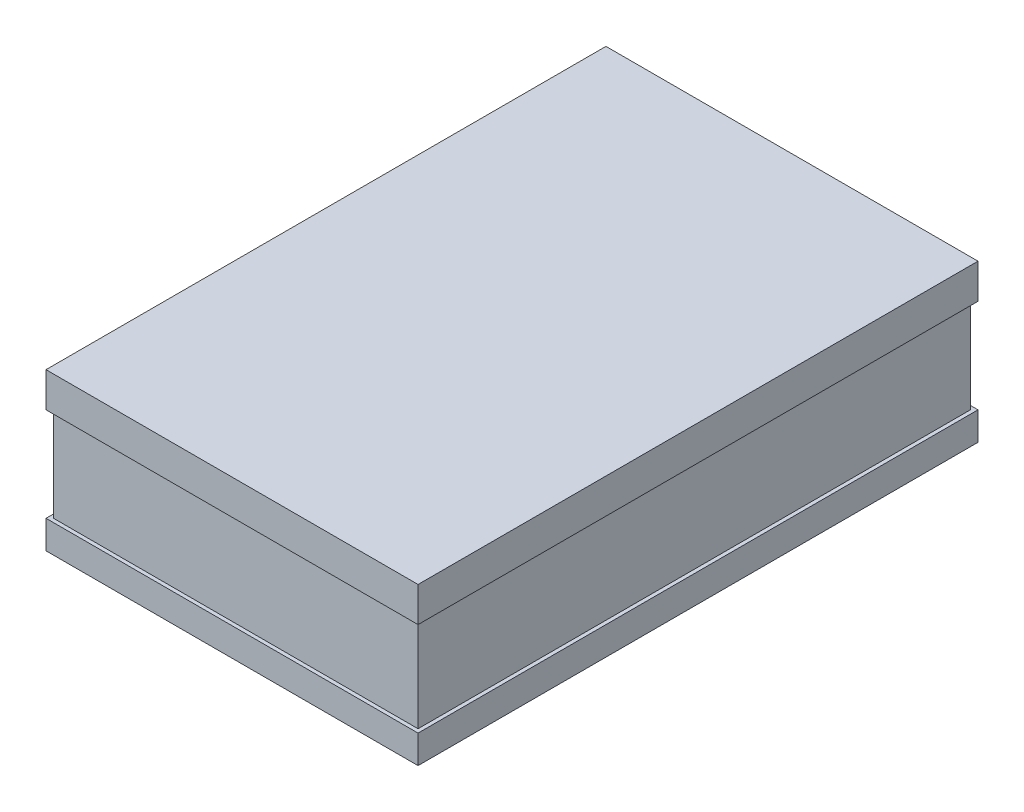
ISO-10303-21;
HEADER;
FILE_DESCRIPTION(('STEP AP214'),'2;1');
FILE_NAME('part.step','',(''),(''),'','','');
FILE_SCHEMA(('AUTOMOTIVE_DESIGN { 1 0 10303 214 1 1 1 1 }'));
ENDSEC;
DATA;
#1=APPLICATION_CONTEXT('core data for automotive mechanical design processes');
#2=APPLICATION_PROTOCOL_DEFINITION('international standard','automotive_design',2000,#1);
#3=PRODUCT_CONTEXT('',#1,'mechanical');
#4=PRODUCT('Part','Part','',(#3));
#5=PRODUCT_RELATED_PRODUCT_CATEGORY('part','',(#4));
#6=PRODUCT_DEFINITION_FORMATION('','',#4);
#7=PRODUCT_DEFINITION_CONTEXT('part definition',#1,'design');
#8=PRODUCT_DEFINITION('design','',#6,#7);
#9=PRODUCT_DEFINITION_SHAPE('','',#8);
#10=(LENGTH_UNIT() NAMED_UNIT(*) SI_UNIT(.MILLI.,.METRE.));
#11=(NAMED_UNIT(*) PLANE_ANGLE_UNIT() SI_UNIT($,.RADIAN.));
#12=(NAMED_UNIT(*) SI_UNIT($,.STERADIAN.) SOLID_ANGLE_UNIT());
#13=UNCERTAINTY_MEASURE_WITH_UNIT(LENGTH_MEASURE(1.E-05),#10,'distance_accuracy_value','');
#14=(GEOMETRIC_REPRESENTATION_CONTEXT(3) GLOBAL_UNCERTAINTY_ASSIGNED_CONTEXT((#13)) GLOBAL_UNIT_ASSIGNED_CONTEXT((#10,
#11,#12)) REPRESENTATION_CONTEXT('',''));
#15=CARTESIAN_POINT('',(0.,0.,0.));
#16=DIRECTION('',(0.,0.,1.));
#17=DIRECTION('',(1.,0.,0.));
#18=AXIS2_PLACEMENT_3D('',#15,#16,#17);
#19=CARTESIAN_POINT('',(-99.,-80.,149.));
#20=DIRECTION('',(-1.,0.,0.));
#21=DIRECTION('',(0.,0.,1.));
#22=AXIS2_PLACEMENT_3D('',#19,#20,#21);
#23=PLANE('',#22);
#24=DIRECTION('',(0.,1.,0.));
#25=VECTOR('',#24,1.);
#26=CARTESIAN_POINT('',(-99.,-80.,149.));
#27=LINE('',#26,#25);
#28=CARTESIAN_POINT('',(-99.,-80.,149.));
#29=VERTEX_POINT('',#28);
#30=CARTESIAN_POINT('',(-99.,-65.,149.));
#31=VERTEX_POINT('',#30);
#32=EDGE_CURVE('E320',#29,#31,#27,.T.);
#33=ORIENTED_EDGE('',*,*,#32,.T.);
#34=DIRECTION('',(0.,0.,-1.));
#35=VECTOR('',#34,1.);
#36=CARTESIAN_POINT('',(-99.,-65.,149.));
#37=LINE('',#36,#35);
#38=CARTESIAN_POINT('',(-99.,-65.,-149.));
#39=VERTEX_POINT('',#38);
#40=EDGE_CURVE('E55',#31,#39,#37,.T.);
#41=ORIENTED_EDGE('',*,*,#40,.T.);
#42=DIRECTION('',(0.,1.,0.));
#43=VECTOR('',#42,1.);
#44=CARTESIAN_POINT('',(-99.,-80.,-149.));
#45=LINE('',#44,#43);
#46=CARTESIAN_POINT('',(-99.,-80.,-149.));
#47=VERTEX_POINT('',#46);
#48=EDGE_CURVE('E305',#47,#39,#45,.T.);
#49=ORIENTED_EDGE('',*,*,#48,.F.);
#50=DIRECTION('',(0.,0.,1.));
#51=VECTOR('',#50,1.);
#52=CARTESIAN_POINT('',(-99.,-80.,149.));
#53=LINE('',#52,#51);
#54=EDGE_CURVE('E277',#47,#29,#53,.T.);
#55=ORIENTED_EDGE('',*,*,#54,.T.);
#56=EDGE_LOOP('',(#33,#41,#49,#55));
#57=FACE_BOUND('',#56,.T.);
#58=ADVANCED_FACE('F39',(#57),#23,.T.);
#59=CARTESIAN_POINT('',(-99.,-80.,-149.));
#60=DIRECTION('',(0.,0.,-1.));
#61=DIRECTION('',(-1.,0.,0.));
#62=AXIS2_PLACEMENT_3D('',#59,#60,#61);
#63=PLANE('',#62);
#64=ORIENTED_EDGE('',*,*,#48,.T.);
#65=DIRECTION('',(1.,0.,0.));
#66=VECTOR('',#65,1.);
#67=CARTESIAN_POINT('',(-99.,-65.,-149.));
#68=LINE('',#67,#66);
#69=CARTESIAN_POINT('',(99.,-65.,-149.));
#70=VERTEX_POINT('',#69);
#71=EDGE_CURVE('E210',#39,#70,#68,.T.);
#72=ORIENTED_EDGE('',*,*,#71,.T.);
#73=DIRECTION('',(0.,1.,0.));
#74=VECTOR('',#73,1.);
#75=CARTESIAN_POINT('',(99.,-80.,-149.));
#76=LINE('',#75,#74);
#77=CARTESIAN_POINT('',(99.,-80.,-149.));
#78=VERTEX_POINT('',#77);
#79=EDGE_CURVE('E310',#78,#70,#76,.T.);
#80=ORIENTED_EDGE('',*,*,#79,.F.);
#81=DIRECTION('',(-1.,0.,0.));
#82=VECTOR('',#81,1.);
#83=CARTESIAN_POINT('',(-99.,-80.,-149.));
#84=LINE('',#83,#82);
#85=EDGE_CURVE('E300',#78,#47,#84,.T.);
#86=ORIENTED_EDGE('',*,*,#85,.T.);
#87=EDGE_LOOP('',(#64,#72,#80,#86));
#88=FACE_BOUND('',#87,.T.);
#89=ADVANCED_FACE('F334',(#88),#63,.T.);
#90=CARTESIAN_POINT('',(99.,-80.,149.));
#91=DIRECTION('',(1.,0.,0.));
#92=DIRECTION('',(0.,0.,-1.));
#93=AXIS2_PLACEMENT_3D('',#90,#91,#92);
#94=PLANE('',#93);
#95=ORIENTED_EDGE('',*,*,#79,.T.);
#96=DIRECTION('',(0.,0.,1.));
#97=VECTOR('',#96,1.);
#98=CARTESIAN_POINT('',(99.,-65.,149.));
#99=LINE('',#98,#97);
#100=CARTESIAN_POINT('',(99.0000000000001,-65.,149.));
#101=VERTEX_POINT('',#100);
#102=EDGE_CURVE('E201',#70,#101,#99,.T.);
#103=ORIENTED_EDGE('',*,*,#102,.T.);
#104=DIRECTION('',(0.,1.,0.));
#105=VECTOR('',#104,1.);
#106=CARTESIAN_POINT('',(99.,-80.,149.));
#107=LINE('',#106,#105);
#108=CARTESIAN_POINT('',(99.,-80.,149.));
#109=VERTEX_POINT('',#108);
#110=EDGE_CURVE('E315',#109,#101,#107,.T.);
#111=ORIENTED_EDGE('',*,*,#110,.F.);
#112=DIRECTION('',(0.,0.,-1.));
#113=VECTOR('',#112,1.);
#114=CARTESIAN_POINT('',(99.,-80.,149.));
#115=LINE('',#114,#113);
#116=EDGE_CURVE('E296',#109,#78,#115,.T.);
#117=ORIENTED_EDGE('',*,*,#116,.T.);
#118=EDGE_LOOP('',(#95,#103,#111,#117));
#119=FACE_BOUND('',#118,.T.);
#120=ADVANCED_FACE('F336',(#119),#94,.T.);
#121=CARTESIAN_POINT('',(-99.,-80.,149.));
#122=DIRECTION('',(0.,0.,1.));
#123=DIRECTION('',(1.,0.,0.));
#124=AXIS2_PLACEMENT_3D('',#121,#122,#123);
#125=PLANE('',#124);
#126=ORIENTED_EDGE('',*,*,#110,.T.);
#127=DIRECTION('',(-1.,0.,0.));
#128=VECTOR('',#127,1.);
#129=CARTESIAN_POINT('',(-99.,-65.,149.));
#130=LINE('',#129,#128);
#131=EDGE_CURVE('E48',#101,#31,#130,.T.);
#132=ORIENTED_EDGE('',*,*,#131,.T.);
#133=ORIENTED_EDGE('',*,*,#32,.F.);
#134=DIRECTION('',(1.,0.,0.));
#135=VECTOR('',#134,1.);
#136=CARTESIAN_POINT('',(-99.,-80.,149.));
#137=LINE('',#136,#135);
#138=EDGE_CURVE('E292',#29,#109,#137,.T.);
#139=ORIENTED_EDGE('',*,*,#138,.T.);
#140=EDGE_LOOP('',(#126,#132,#133,#139));
#141=FACE_BOUND('',#140,.T.);
#142=ADVANCED_FACE('F325',(#141),#125,.T.);
#143=CARTESIAN_POINT('',(0.,-80.,0.));
#144=DIRECTION('',(0.,-1.,0.));
#145=DIRECTION('',(0.,0.,-1.));
#146=AXIS2_PLACEMENT_3D('',#143,#144,#145);
#147=PLANE('',#146);
#148=DIRECTION('',(1.,0.,0.));
#149=VECTOR('',#148,1.);
#150=CARTESIAN_POINT('',(-87.5,-80.,137.5));
#151=LINE('',#150,#149);
#152=CARTESIAN_POINT('',(-87.5,-80.,137.5));
#153=VERTEX_POINT('',#152);
#154=CARTESIAN_POINT('',(87.5000000000001,-80.,137.5));
#155=VERTEX_POINT('',#154);
#156=EDGE_CURVE('E241',#153,#155,#151,.T.);
#157=ORIENTED_EDGE('',*,*,#156,.T.);
#158=DIRECTION('',(0.,0.,-1.));
#159=VECTOR('',#158,1.);
#160=CARTESIAN_POINT('',(87.5000000000001,-80.,137.5));
#161=LINE('',#160,#159);
#162=CARTESIAN_POINT('',(87.5000000000001,-80.,-137.5));
#163=VERTEX_POINT('',#162);
#164=EDGE_CURVE('E245',#155,#163,#161,.T.);
#165=ORIENTED_EDGE('',*,*,#164,.T.);
#166=DIRECTION('',(-1.,0.,0.));
#167=VECTOR('',#166,1.);
#168=CARTESIAN_POINT('',(-87.5,-80.,-137.5));
#169=LINE('',#168,#167);
#170=CARTESIAN_POINT('',(-87.5,-80.,-137.5));
#171=VERTEX_POINT('',#170);
#172=EDGE_CURVE('E250',#163,#171,#169,.T.);
#173=ORIENTED_EDGE('',*,*,#172,.T.);
#174=DIRECTION('',(0.,0.,1.));
#175=VECTOR('',#174,1.);
#176=CARTESIAN_POINT('',(-87.5,-80.,137.5));
#177=LINE('',#176,#175);
#178=EDGE_CURVE('E254',#171,#153,#177,.T.);
#179=ORIENTED_EDGE('',*,*,#178,.T.);
#180=EDGE_LOOP('',(#157,#165,#173,#179));
#181=FACE_BOUND('',#180,.T.);
#182=ORIENTED_EDGE('',*,*,#54,.F.);
#183=ORIENTED_EDGE('',*,*,#85,.F.);
#184=ORIENTED_EDGE('',*,*,#116,.F.);
#185=ORIENTED_EDGE('',*,*,#138,.F.);
#186=EDGE_LOOP('',(#182,#183,#184,#185));
#187=FACE_BOUND('',#186,.T.);
#188=ADVANCED_FACE('F331',(#181,#187),#147,.T.);
#189=CARTESIAN_POINT('',(-87.5,-80.,137.5));
#190=DIRECTION('',(0.,0.,1.));
#191=DIRECTION('',(1.,0.,0.));
#192=AXIS2_PLACEMENT_3D('',#189,#190,#191);
#193=PLANE('',#192);
#194=DIRECTION('',(1.,0.,0.));
#195=VECTOR('',#194,1.);
#196=CARTESIAN_POINT('',(-87.5,0.,137.5));
#197=LINE('',#196,#195);
#198=CARTESIAN_POINT('',(-87.5,0.,137.5));
#199=VERTEX_POINT('',#198);
#200=CARTESIAN_POINT('',(87.5000000000001,0.,137.5));
#201=VERTEX_POINT('',#200);
#202=EDGE_CURVE('E240',#199,#201,#197,.T.);
#203=ORIENTED_EDGE('',*,*,#202,.T.);
#204=DIRECTION('',(0.,1.,0.));
#205=VECTOR('',#204,1.);
#206=CARTESIAN_POINT('',(87.5000000000001,-80.,137.5));
#207=LINE('',#206,#205);
#208=EDGE_CURVE('E258',#155,#201,#207,.T.);
#209=ORIENTED_EDGE('',*,*,#208,.F.);
#210=ORIENTED_EDGE('',*,*,#156,.F.);
#211=DIRECTION('',(0.,1.,0.));
#212=VECTOR('',#211,1.);
#213=CARTESIAN_POINT('',(-87.5,-80.,137.5));
#214=LINE('',#213,#212);
#215=EDGE_CURVE('E273',#153,#199,#214,.T.);
#216=ORIENTED_EDGE('',*,*,#215,.T.);
#217=EDGE_LOOP('',(#203,#209,#210,#216));
#218=FACE_BOUND('',#217,.T.);
#219=ADVANCED_FACE('F399',(#218),#193,.F.);
#220=CARTESIAN_POINT('',(-87.5,-80.,137.5));
#221=DIRECTION('',(-1.,0.,0.));
#222=DIRECTION('',(0.,0.,1.));
#223=AXIS2_PLACEMENT_3D('',#220,#221,#222);
#224=PLANE('',#223);
#225=DIRECTION('',(0.,0.,1.));
#226=VECTOR('',#225,1.);
#227=CARTESIAN_POINT('',(-87.5,0.,137.5));
#228=LINE('',#227,#226);
#229=CARTESIAN_POINT('',(-87.5,0.,-137.5));
#230=VERTEX_POINT('',#229);
#231=EDGE_CURVE('E246',#230,#199,#228,.T.);
#232=ORIENTED_EDGE('',*,*,#231,.T.);
#233=ORIENTED_EDGE('',*,*,#215,.F.);
#234=ORIENTED_EDGE('',*,*,#178,.F.);
#235=DIRECTION('',(0.,1.,0.));
#236=VECTOR('',#235,1.);
#237=CARTESIAN_POINT('',(-87.5,-80.,-137.5));
#238=LINE('',#237,#236);
#239=EDGE_CURVE('E278',#171,#230,#238,.T.);
#240=ORIENTED_EDGE('',*,*,#239,.T.);
#241=EDGE_LOOP('',(#232,#233,#234,#240));
#242=FACE_BOUND('',#241,.T.);
#243=ADVANCED_FACE('F405',(#242),#224,.F.);
#244=CARTESIAN_POINT('',(-87.5,-80.,-137.5));
#245=DIRECTION('',(0.,0.,-1.));
#246=DIRECTION('',(-1.,0.,0.));
#247=AXIS2_PLACEMENT_3D('',#244,#245,#246);
#248=PLANE('',#247);
#249=DIRECTION('',(-1.,0.,0.));
#250=VECTOR('',#249,1.);
#251=CARTESIAN_POINT('',(-87.5,0.,-137.5));
#252=LINE('',#251,#250);
#253=CARTESIAN_POINT('',(87.5000000000001,0.,-137.5));
#254=VERTEX_POINT('',#253);
#255=EDGE_CURVE('E266',#254,#230,#252,.T.);
#256=ORIENTED_EDGE('',*,*,#255,.T.);
#257=ORIENTED_EDGE('',*,*,#239,.F.);
#258=ORIENTED_EDGE('',*,*,#172,.F.);
#259=DIRECTION('',(0.,1.,0.));
#260=VECTOR('',#259,1.);
#261=CARTESIAN_POINT('',(87.5000000000001,-80.,-137.5));
#262=LINE('',#261,#260);
#263=EDGE_CURVE('E282',#163,#254,#262,.T.);
#264=ORIENTED_EDGE('',*,*,#263,.T.);
#265=EDGE_LOOP('',(#256,#257,#258,#264));
#266=FACE_BOUND('',#265,.T.);
#267=ADVANCED_FACE('F413',(#266),#248,.F.);
#268=CARTESIAN_POINT('',(87.5000000000001,-80.,137.5));
#269=DIRECTION('',(1.,0.,0.));
#270=DIRECTION('',(0.,0.,-1.));
#271=AXIS2_PLACEMENT_3D('',#268,#269,#270);
#272=PLANE('',#271);
#273=DIRECTION('',(0.,0.,-1.));
#274=VECTOR('',#273,1.);
#275=CARTESIAN_POINT('',(87.5000000000001,0.,137.5));
#276=LINE('',#275,#274);
#277=EDGE_CURVE('E262',#201,#254,#276,.T.);
#278=ORIENTED_EDGE('',*,*,#277,.T.);
#279=ORIENTED_EDGE('',*,*,#263,.F.);
#280=ORIENTED_EDGE('',*,*,#164,.F.);
#281=ORIENTED_EDGE('',*,*,#208,.T.);
#282=EDGE_LOOP('',(#278,#279,#280,#281));
#283=FACE_BOUND('',#282,.T.);
#284=ADVANCED_FACE('F409',(#283),#272,.F.);
#285=CARTESIAN_POINT('',(0.,0.,0.));
#286=DIRECTION('',(0.,1.,0.));
#287=DIRECTION('',(0.,0.,1.));
#288=AXIS2_PLACEMENT_3D('',#285,#286,#287);
#289=PLANE('',#288);
#290=ORIENTED_EDGE('',*,*,#277,.F.);
#291=ORIENTED_EDGE('',*,*,#202,.F.);
#292=ORIENTED_EDGE('',*,*,#231,.F.);
#293=ORIENTED_EDGE('',*,*,#255,.F.);
#294=EDGE_LOOP('',(#290,#291,#292,#293));
#295=FACE_BOUND('',#294,.T.);
#296=ADVANCED_FACE('F412',(#295),#289,.F.);
#297=CARTESIAN_POINT('',(0.,-15.,0.));
#298=DIRECTION('',(0.,1.,0.));
#299=DIRECTION('',(0.,0.,1.));
#300=AXIS2_PLACEMENT_3D('',#297,#298,#299);
#301=PLANE('',#300);
#302=DIRECTION('',(0.,0.,-1.));
#303=VECTOR('',#302,1.);
#304=CARTESIAN_POINT('',(-99.,-15.,149.));
#305=LINE('',#304,#303);
#306=CARTESIAN_POINT('',(-99.,-15.,149.));
#307=VERTEX_POINT('',#306);
#308=CARTESIAN_POINT('',(-99.,-15.,-149.));
#309=VERTEX_POINT('',#308);
#310=EDGE_CURVE('E221',#307,#309,#305,.T.);
#311=ORIENTED_EDGE('',*,*,#310,.T.);
#312=DIRECTION('',(1.,0.,0.));
#313=VECTOR('',#312,1.);
#314=CARTESIAN_POINT('',(-99.,-15.,-149.));
#315=LINE('',#314,#313);
#316=CARTESIAN_POINT('',(99.,-15.,-149.));
#317=VERTEX_POINT('',#316);
#318=EDGE_CURVE('E218',#309,#317,#315,.T.);
#319=ORIENTED_EDGE('',*,*,#318,.T.);
#320=DIRECTION('',(0.,0.,1.));
#321=VECTOR('',#320,1.);
#322=CARTESIAN_POINT('',(99.,-15.,149.));
#323=LINE('',#322,#321);
#324=CARTESIAN_POINT('',(99.,-15.,149.));
#325=VERTEX_POINT('',#324);
#326=EDGE_CURVE('E62',#317,#325,#323,.T.);
#327=ORIENTED_EDGE('',*,*,#326,.T.);
#328=DIRECTION('',(-1.,0.,0.));
#329=VECTOR('',#328,1.);
#330=CARTESIAN_POINT('',(-99.,-15.,149.));
#331=LINE('',#330,#329);
#332=EDGE_CURVE('E11',#325,#307,#331,.T.);
#333=ORIENTED_EDGE('',*,*,#332,.T.);
#334=EDGE_LOOP('',(#311,#319,#327,#333));
#335=FACE_BOUND('',#334,.T.);
#336=DIRECTION('',(0.,0.,-1.));
#337=VECTOR('',#336,1.);
#338=CARTESIAN_POINT('',(-97.,-15.,-147.));
#339=LINE('',#338,#337);
#340=CARTESIAN_POINT('',(-97.,-15.,147.));
#341=VERTEX_POINT('',#340);
#342=CARTESIAN_POINT('',(-97.,-15.,-147.));
#343=VERTEX_POINT('',#342);
#344=EDGE_CURVE('E170',#341,#343,#339,.T.);
#345=ORIENTED_EDGE('',*,*,#344,.F.);
#346=DIRECTION('',(-1.,0.,0.));
#347=VECTOR('',#346,1.);
#348=CARTESIAN_POINT('',(-97.,-15.,147.));
#349=LINE('',#348,#347);
#350=CARTESIAN_POINT('',(97.,-15.,147.));
#351=VERTEX_POINT('',#350);
#352=EDGE_CURVE('E164',#351,#341,#349,.T.);
#353=ORIENTED_EDGE('',*,*,#352,.F.);
#354=DIRECTION('',(0.,0.,1.));
#355=VECTOR('',#354,1.);
#356=CARTESIAN_POINT('',(97.,-15.,-147.));
#357=LINE('',#356,#355);
#358=CARTESIAN_POINT('',(97.,-15.,-147.));
#359=VERTEX_POINT('',#358);
#360=EDGE_CURVE('E173',#359,#351,#357,.T.);
#361=ORIENTED_EDGE('',*,*,#360,.F.);
#362=DIRECTION('',(1.,0.,0.));
#363=VECTOR('',#362,1.);
#364=CARTESIAN_POINT('',(-97.,-15.,-147.));
#365=LINE('',#364,#363);
#366=EDGE_CURVE('E156',#343,#359,#365,.T.);
#367=ORIENTED_EDGE('',*,*,#366,.F.);
#368=EDGE_LOOP('',(#345,#353,#361,#367));
#369=FACE_BOUND('',#368,.T.);
#370=ADVANCED_FACE('F168',(#335,#369),#301,.F.);
#371=CARTESIAN_POINT('',(0.,-65.,0.));
#372=DIRECTION('',(0.,1.,0.));
#373=DIRECTION('',(0.,0.,1.));
#374=AXIS2_PLACEMENT_3D('',#371,#372,#373);
#375=PLANE('',#374);
#376=ORIENTED_EDGE('',*,*,#131,.F.);
#377=ORIENTED_EDGE('',*,*,#102,.F.);
#378=ORIENTED_EDGE('',*,*,#71,.F.);
#379=ORIENTED_EDGE('',*,*,#40,.F.);
#380=EDGE_LOOP('',(#376,#377,#378,#379));
#381=FACE_BOUND('',#380,.T.);
#382=DIRECTION('',(1.,0.,0.));
#383=VECTOR('',#382,1.);
#384=CARTESIAN_POINT('',(-97.,-65.,-147.));
#385=LINE('',#384,#383);
#386=CARTESIAN_POINT('',(-97.,-65.,-147.));
#387=VERTEX_POINT('',#386);
#388=CARTESIAN_POINT('',(97.,-65.,-147.));
#389=VERTEX_POINT('',#388);
#390=EDGE_CURVE('E158',#387,#389,#385,.T.);
#391=ORIENTED_EDGE('',*,*,#390,.T.);
#392=DIRECTION('',(0.,0.,1.));
#393=VECTOR('',#392,1.);
#394=CARTESIAN_POINT('',(97.,-65.,-147.));
#395=LINE('',#394,#393);
#396=CARTESIAN_POINT('',(97.,-65.,147.));
#397=VERTEX_POINT('',#396);
#398=EDGE_CURVE('E184',#389,#397,#395,.T.);
#399=ORIENTED_EDGE('',*,*,#398,.T.);
#400=DIRECTION('',(-1.,0.,0.));
#401=VECTOR('',#400,1.);
#402=CARTESIAN_POINT('',(-97.,-65.,147.));
#403=LINE('',#402,#401);
#404=CARTESIAN_POINT('',(-97.,-65.,147.));
#405=VERTEX_POINT('',#404);
#406=EDGE_CURVE('E180',#397,#405,#403,.T.);
#407=ORIENTED_EDGE('',*,*,#406,.T.);
#408=DIRECTION('',(0.,0.,-1.));
#409=VECTOR('',#408,1.);
#410=CARTESIAN_POINT('',(-97.,-65.,-147.));
#411=LINE('',#410,#409);
#412=EDGE_CURVE('E191',#405,#387,#411,.T.);
#413=ORIENTED_EDGE('',*,*,#412,.T.);
#414=EDGE_LOOP('',(#391,#399,#407,#413));
#415=FACE_BOUND('',#414,.T.);
#416=ADVANCED_FACE('F337',(#381,#415),#375,.T.);
#417=CARTESIAN_POINT('',(-97.,-15.,-147.));
#418=DIRECTION('',(-1.,0.,0.));
#419=DIRECTION('',(0.,0.,1.));
#420=AXIS2_PLACEMENT_3D('',#417,#418,#419);
#421=PLANE('',#420);
#422=ORIENTED_EDGE('',*,*,#412,.F.);
#423=DIRECTION('',(0.,-1.,0.));
#424=VECTOR('',#423,1.);
#425=CARTESIAN_POINT('',(-97.,-15.,147.));
#426=LINE('',#425,#424);
#427=EDGE_CURVE('E178',#341,#405,#426,.T.);
#428=ORIENTED_EDGE('',*,*,#427,.F.);
#429=ORIENTED_EDGE('',*,*,#344,.T.);
#430=DIRECTION('',(0.,-1.,0.));
#431=VECTOR('',#430,1.);
#432=CARTESIAN_POINT('',(-97.,-15.,-147.));
#433=LINE('',#432,#431);
#434=EDGE_CURVE('E153',#343,#387,#433,.T.);
#435=ORIENTED_EDGE('',*,*,#434,.T.);
#436=EDGE_LOOP('',(#422,#428,#429,#435));
#437=FACE_BOUND('',#436,.T.);
#438=ADVANCED_FACE('F177',(#437),#421,.T.);
#439=CARTESIAN_POINT('',(-97.,-15.,147.));
#440=DIRECTION('',(0.,0.,1.));
#441=DIRECTION('',(1.,0.,0.));
#442=AXIS2_PLACEMENT_3D('',#439,#440,#441);
#443=PLANE('',#442);
#444=ORIENTED_EDGE('',*,*,#406,.F.);
#445=DIRECTION('',(0.,-1.,0.));
#446=VECTOR('',#445,1.);
#447=CARTESIAN_POINT('',(97.,-15.,147.));
#448=LINE('',#447,#446);
#449=EDGE_CURVE('E202',#351,#397,#448,.T.);
#450=ORIENTED_EDGE('',*,*,#449,.F.);
#451=ORIENTED_EDGE('',*,*,#352,.T.);
#452=ORIENTED_EDGE('',*,*,#427,.T.);
#453=EDGE_LOOP('',(#444,#450,#451,#452));
#454=FACE_BOUND('',#453,.T.);
#455=ADVANCED_FACE('F346',(#454),#443,.T.);
#456=CARTESIAN_POINT('',(97.,-15.,-147.));
#457=DIRECTION('',(1.,0.,0.));
#458=DIRECTION('',(0.,0.,-1.));
#459=AXIS2_PLACEMENT_3D('',#456,#457,#458);
#460=PLANE('',#459);
#461=ORIENTED_EDGE('',*,*,#398,.F.);
#462=DIRECTION('',(0.,-1.,0.));
#463=VECTOR('',#462,1.);
#464=CARTESIAN_POINT('',(97.,-15.,-147.));
#465=LINE('',#464,#463);
#466=EDGE_CURVE('E163',#359,#389,#465,.T.);
#467=ORIENTED_EDGE('',*,*,#466,.F.);
#468=ORIENTED_EDGE('',*,*,#360,.T.);
#469=ORIENTED_EDGE('',*,*,#449,.T.);
#470=EDGE_LOOP('',(#461,#467,#468,#469));
#471=FACE_BOUND('',#470,.T.);
#472=ADVANCED_FACE('F344',(#471),#460,.T.);
#473=CARTESIAN_POINT('',(-97.,-15.,-147.));
#474=DIRECTION('',(0.,0.,-1.));
#475=DIRECTION('',(-1.,0.,0.));
#476=AXIS2_PLACEMENT_3D('',#473,#474,#475);
#477=PLANE('',#476);
#478=ORIENTED_EDGE('',*,*,#390,.F.);
#479=ORIENTED_EDGE('',*,*,#434,.F.);
#480=ORIENTED_EDGE('',*,*,#366,.T.);
#481=ORIENTED_EDGE('',*,*,#466,.T.);
#482=EDGE_LOOP('',(#478,#479,#480,#481));
#483=FACE_BOUND('',#482,.T.);
#484=ADVANCED_FACE('F155',(#483),#477,.T.);
#485=CARTESIAN_POINT('',(0.,3.5,0.));
#486=DIRECTION('',(0.,1.,0.));
#487=DIRECTION('',(0.,0.,1.));
#488=AXIS2_PLACEMENT_3D('',#485,#486,#487);
#489=PLANE('',#488);
#490=DIRECTION('',(0.,0.,1.));
#491=VECTOR('',#490,1.);
#492=CARTESIAN_POINT('',(-99.,3.5,-149.));
#493=LINE('',#492,#491);
#494=CARTESIAN_POINT('',(-99.,3.5,-149.));
#495=VERTEX_POINT('',#494);
#496=CARTESIAN_POINT('',(-99.,3.5,149.));
#497=VERTEX_POINT('',#496);
#498=EDGE_CURVE('E224',#495,#497,#493,.T.);
#499=ORIENTED_EDGE('',*,*,#498,.T.);
#500=DIRECTION('',(1.,0.,0.));
#501=VECTOR('',#500,1.);
#502=CARTESIAN_POINT('',(-99.,3.5,149.));
#503=LINE('',#502,#501);
#504=CARTESIAN_POINT('',(99.,3.5,149.));
#505=VERTEX_POINT('',#504);
#506=EDGE_CURVE('E228',#497,#505,#503,.T.);
#507=ORIENTED_EDGE('',*,*,#506,.T.);
#508=DIRECTION('',(0.,0.,-1.));
#509=VECTOR('',#508,1.);
#510=CARTESIAN_POINT('',(99.,3.5,-149.));
#511=LINE('',#510,#509);
#512=CARTESIAN_POINT('',(99.,3.5,-149.));
#513=VERTEX_POINT('',#512);
#514=EDGE_CURVE('E232',#505,#513,#511,.T.);
#515=ORIENTED_EDGE('',*,*,#514,.T.);
#516=DIRECTION('',(-1.,0.,0.));
#517=VECTOR('',#516,1.);
#518=CARTESIAN_POINT('',(-99.,3.5,-149.));
#519=LINE('',#518,#517);
#520=EDGE_CURVE('E236',#513,#495,#519,.T.);
#521=ORIENTED_EDGE('',*,*,#520,.T.);
#522=EDGE_LOOP('',(#499,#507,#515,#521));
#523=FACE_BOUND('',#522,.T.);
#524=ADVANCED_FACE('F384',(#523),#489,.T.);
#525=ORIENTED_EDGE('',*,*,#332,.F.);
#526=EDGE_CURVE('E319',#325,#505,#107,.T.);
#527=ORIENTED_EDGE('',*,*,#526,.T.);
#528=ORIENTED_EDGE('',*,*,#506,.F.);
#529=EDGE_CURVE('E304',#307,#497,#27,.T.);
#530=ORIENTED_EDGE('',*,*,#529,.F.);
#531=EDGE_LOOP('',(#525,#527,#528,#530));
#532=FACE_BOUND('',#531,.T.);
#533=ADVANCED_FACE('F375',(#532),#125,.T.);
#534=ORIENTED_EDGE('',*,*,#326,.F.);
#535=EDGE_CURVE('E314',#317,#513,#76,.T.);
#536=ORIENTED_EDGE('',*,*,#535,.T.);
#537=ORIENTED_EDGE('',*,*,#514,.F.);
#538=ORIENTED_EDGE('',*,*,#526,.F.);
#539=EDGE_LOOP('',(#534,#536,#537,#538));
#540=FACE_BOUND('',#539,.T.);
#541=ADVANCED_FACE('F366',(#540),#94,.T.);
#542=ORIENTED_EDGE('',*,*,#318,.F.);
#543=EDGE_CURVE('E309',#309,#495,#45,.T.);
#544=ORIENTED_EDGE('',*,*,#543,.T.);
#545=ORIENTED_EDGE('',*,*,#520,.F.);
#546=ORIENTED_EDGE('',*,*,#535,.F.);
#547=EDGE_LOOP('',(#542,#544,#545,#546));
#548=FACE_BOUND('',#547,.T.);
#549=ADVANCED_FACE('F360',(#548),#63,.T.);
#550=ORIENTED_EDGE('',*,*,#310,.F.);
#551=ORIENTED_EDGE('',*,*,#529,.T.);
#552=ORIENTED_EDGE('',*,*,#498,.F.);
#553=ORIENTED_EDGE('',*,*,#543,.F.);
#554=EDGE_LOOP('',(#550,#551,#552,#553));
#555=FACE_BOUND('',#554,.T.);
#556=ADVANCED_FACE('F41',(#555),#23,.T.);
#557=CLOSED_SHELL('',(#58,#89,#120,#142,#188,#219,#243,#267,#284,#296,#370,#416,#438,#455,#472,
#484,#524,#533,#541,#549,#556));
#558=MANIFOLD_SOLID_BREP('B2',#557);
#559=ADVANCED_BREP_SHAPE_REPRESENTATION('',(#18,#558),#14);
#560=SHAPE_DEFINITION_REPRESENTATION(#9,#559);
ENDSEC;
END-ISO-10303-21;
